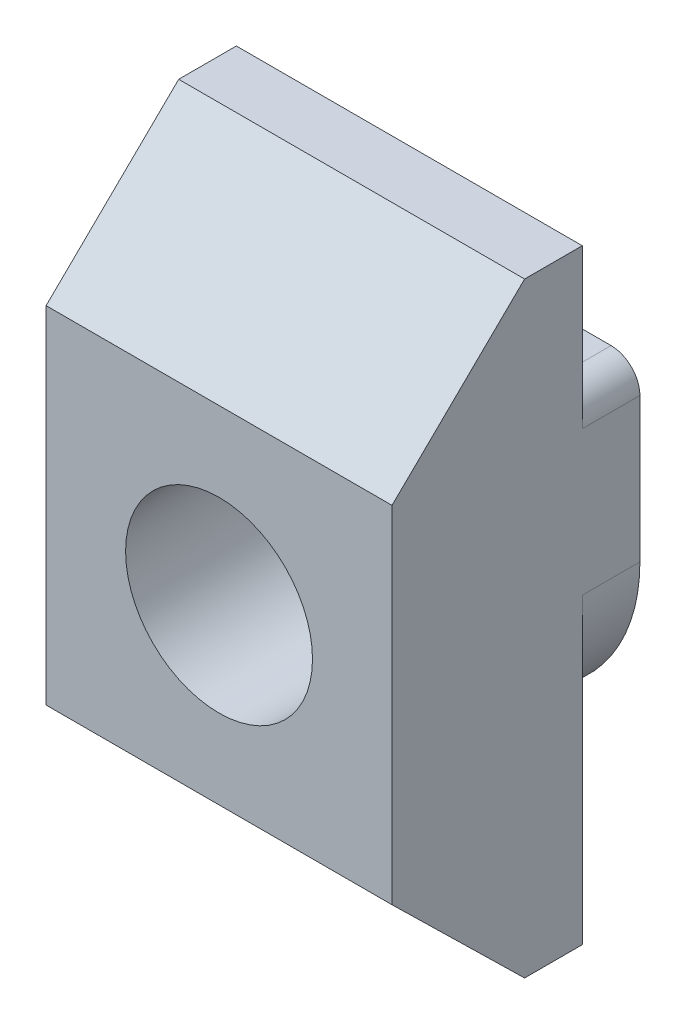
ISO-10303-21;
HEADER;
FILE_DESCRIPTION(('STEP AP214'),'2;1');
FILE_NAME('part.step','',(''),(''),'','','');
FILE_SCHEMA(('AUTOMOTIVE_DESIGN { 1 0 10303 214 1 1 1 1 }'));
ENDSEC;
DATA;
#1=APPLICATION_CONTEXT('core data for automotive mechanical design processes');
#2=APPLICATION_PROTOCOL_DEFINITION('international standard','automotive_design',2000,#1);
#3=PRODUCT_CONTEXT('',#1,'mechanical');
#4=PRODUCT('Part','Part','',(#3));
#5=PRODUCT_RELATED_PRODUCT_CATEGORY('part','',(#4));
#6=PRODUCT_DEFINITION_FORMATION('','',#4);
#7=PRODUCT_DEFINITION_CONTEXT('part definition',#1,'design');
#8=PRODUCT_DEFINITION('design','',#6,#7);
#9=PRODUCT_DEFINITION_SHAPE('','',#8);
#10=(LENGTH_UNIT() NAMED_UNIT(*) SI_UNIT(.MILLI.,.METRE.));
#11=(NAMED_UNIT(*) PLANE_ANGLE_UNIT() SI_UNIT($,.RADIAN.));
#12=(NAMED_UNIT(*) SI_UNIT($,.STERADIAN.) SOLID_ANGLE_UNIT());
#13=UNCERTAINTY_MEASURE_WITH_UNIT(LENGTH_MEASURE(1.E-05),#10,'distance_accuracy_value','');
#14=(GEOMETRIC_REPRESENTATION_CONTEXT(3) GLOBAL_UNCERTAINTY_ASSIGNED_CONTEXT((#13)) GLOBAL_UNIT_ASSIGNED_CONTEXT((#10,
#11,#12)) REPRESENTATION_CONTEXT('',''));
#15=CARTESIAN_POINT('',(0.,0.,0.));
#16=DIRECTION('',(0.,0.,1.));
#17=DIRECTION('',(1.,0.,0.));
#18=AXIS2_PLACEMENT_3D('',#15,#16,#17);
#19=CARTESIAN_POINT('',(0.,0.,-500.));
#20=DIRECTION('',(0.,0.,1.));
#21=DIRECTION('',(-1.,0.,0.));
#22=AXIS2_PLACEMENT_3D('',#19,#20,#21);
#23=CYLINDRICAL_SURFACE('',#22,1.621);
#24=CARTESIAN_POINT('',(0.,0.,-1.));
#25=DIRECTION('',(0.,0.,-1.));
#26=DIRECTION('',(-1.,0.,0.));
#27=AXIS2_PLACEMENT_3D('',#24,#25,#26);
#28=CIRCLE('',#27,1.621);
#29=CARTESIAN_POINT('',(-1.621,0.,-1.));
#30=VERTEX_POINT('',#29);
#31=EDGE_CURVE('E11',#30,#30,#28,.T.);
#32=ORIENTED_EDGE('',*,*,#31,.T.);
#33=EDGE_LOOP('',(#32));
#34=FACE_BOUND('',#33,.T.);
#35=CARTESIAN_POINT('',(0.,0.,3.3));
#36=DIRECTION('',(0.,0.,-1.));
#37=DIRECTION('',(-1.,0.,0.));
#38=AXIS2_PLACEMENT_3D('',#35,#36,#37);
#39=CIRCLE('',#38,1.621);
#40=CARTESIAN_POINT('',(-1.621,0.,3.3));
#41=VERTEX_POINT('',#40);
#42=EDGE_CURVE('E187',#41,#41,#39,.T.);
#43=ORIENTED_EDGE('',*,*,#42,.F.);
#44=EDGE_LOOP('',(#43));
#45=FACE_BOUND('',#44,.T.);
#46=ADVANCED_FACE('F19',(#34,#45),#23,.F.);
#47=CARTESIAN_POINT('',(0.,0.,-1.));
#48=DIRECTION('',(0.,0.,1.));
#49=DIRECTION('',(1.,0.,0.));
#50=AXIS2_PLACEMENT_3D('',#47,#48,#49);
#51=PLANE('',#50);
#52=ORIENTED_EDGE('',*,*,#31,.F.);
#53=EDGE_LOOP('',(#52));
#54=FACE_BOUND('',#53,.T.);
#55=CARTESIAN_POINT('',(0.,0.,-1.));
#56=DIRECTION('',(0.,0.,1.));
#57=DIRECTION('',(1.,0.,0.));
#58=AXIS2_PLACEMENT_3D('',#55,#56,#57);
#59=CIRCLE('',#58,3.);
#60=CARTESIAN_POINT('',(0.,3.,-1.));
#61=VERTEX_POINT('',#60);
#62=CARTESIAN_POINT('',(-3.,0.,-1.));
#63=VERTEX_POINT('',#62);
#64=EDGE_CURVE('E147',#61,#63,#59,.T.);
#65=ORIENTED_EDGE('',*,*,#64,.F.);
#66=DIRECTION('',(-1.,0.,0.));
#67=VECTOR('',#66,1.);
#68=CARTESIAN_POINT('',(2.5,3.,-1.));
#69=LINE('',#68,#67);
#70=CARTESIAN_POINT('',(2.5,3.,-1.));
#71=VERTEX_POINT('',#70);
#72=EDGE_CURVE('E152',#71,#61,#69,.T.);
#73=ORIENTED_EDGE('',*,*,#72,.F.);
#74=CARTESIAN_POINT('',(2.5,2.5,-1.));
#75=DIRECTION('',(0.,0.,1.));
#76=DIRECTION('',(1.,0.,0.));
#77=AXIS2_PLACEMENT_3D('',#74,#75,#76);
#78=CIRCLE('',#77,0.5);
#79=CARTESIAN_POINT('',(3.,2.5,-1.));
#80=VERTEX_POINT('',#79);
#81=EDGE_CURVE('E181',#80,#71,#78,.T.);
#82=ORIENTED_EDGE('',*,*,#81,.F.);
#83=DIRECTION('',(0.,1.,0.));
#84=VECTOR('',#83,1.);
#85=CARTESIAN_POINT('',(3.,0.,-1.));
#86=LINE('',#85,#84);
#87=CARTESIAN_POINT('',(3.,0.,-1.));
#88=VERTEX_POINT('',#87);
#89=EDGE_CURVE('E230',#88,#80,#86,.T.);
#90=ORIENTED_EDGE('',*,*,#89,.F.);
#91=CARTESIAN_POINT('',(0.,0.,-1.));
#92=DIRECTION('',(0.,0.,1.));
#93=DIRECTION('',(1.,0.,0.));
#94=AXIS2_PLACEMENT_3D('',#91,#92,#93);
#95=CIRCLE('',#94,3.);
#96=CARTESIAN_POINT('',(0.,-3.,-1.));
#97=VERTEX_POINT('',#96);
#98=EDGE_CURVE('E232',#97,#88,#95,.T.);
#99=ORIENTED_EDGE('',*,*,#98,.F.);
#100=DIRECTION('',(1.,0.,0.));
#101=VECTOR('',#100,1.);
#102=CARTESIAN_POINT('',(-2.5,-3.,-1.));
#103=LINE('',#102,#101);
#104=CARTESIAN_POINT('',(-2.5,-3.,-1.));
#105=VERTEX_POINT('',#104);
#106=EDGE_CURVE('E201',#105,#97,#103,.T.);
#107=ORIENTED_EDGE('',*,*,#106,.F.);
#108=CARTESIAN_POINT('',(-2.5,-2.5,-1.));
#109=DIRECTION('',(0.,0.,1.));
#110=DIRECTION('',(1.,0.,0.));
#111=AXIS2_PLACEMENT_3D('',#108,#109,#110);
#112=CIRCLE('',#111,0.5);
#113=CARTESIAN_POINT('',(-3.,-2.5,-1.));
#114=VERTEX_POINT('',#113);
#115=EDGE_CURVE('E159',#114,#105,#112,.T.);
#116=ORIENTED_EDGE('',*,*,#115,.F.);
#117=DIRECTION('',(0.,-1.,0.));
#118=VECTOR('',#117,1.);
#119=CARTESIAN_POINT('',(-3.,0.,-1.));
#120=LINE('',#119,#118);
#121=EDGE_CURVE('E30',#63,#114,#120,.T.);
#122=ORIENTED_EDGE('',*,*,#121,.F.);
#123=EDGE_LOOP('',(#65,#73,#82,#90,#99,#107,#116,#122));
#124=FACE_BOUND('',#123,.T.);
#125=ADVANCED_FACE('F149',(#54,#124),#51,.F.);
#126=CARTESIAN_POINT('',(-3.,0.,0.));
#127=DIRECTION('',(1.,0.,0.));
#128=DIRECTION('',(0.,1.,0.));
#129=AXIS2_PLACEMENT_3D('',#126,#127,#128);
#130=PLANE('',#129);
#131=DIRECTION('',(0.,-0.699294155463731,0.714834025585147));
#132=VECTOR('',#131,1.);
#133=CARTESIAN_POINT('',(-3.,5.25,1.));
#134=LINE('',#133,#132);
#135=CARTESIAN_POINT('',(-3.,5.25,1.));
#136=VERTEX_POINT('',#135);
#137=CARTESIAN_POINT('',(-3.,3.,3.3));
#138=VERTEX_POINT('',#137);
#139=EDGE_CURVE('E224',#136,#138,#134,.T.);
#140=ORIENTED_EDGE('',*,*,#139,.F.);
#141=DIRECTION('',(0.,0.,1.));
#142=VECTOR('',#141,1.);
#143=CARTESIAN_POINT('',(-3.,5.25,0.));
#144=LINE('',#143,#142);
#145=CARTESIAN_POINT('',(-3.,5.25,0.));
#146=VERTEX_POINT('',#145);
#147=EDGE_CURVE('E200',#146,#136,#144,.T.);
#148=ORIENTED_EDGE('',*,*,#147,.F.);
#149=DIRECTION('',(0.,1.,0.));
#150=VECTOR('',#149,1.);
#151=CARTESIAN_POINT('',(-3.,-5.25,0.));
#152=LINE('',#151,#150);
#153=CARTESIAN_POINT('',(-3.,0.,0.));
#154=VERTEX_POINT('',#153);
#155=EDGE_CURVE('E219',#154,#146,#152,.T.);
#156=ORIENTED_EDGE('',*,*,#155,.F.);
#157=DIRECTION('',(0.,0.,1.));
#158=VECTOR('',#157,1.);
#159=CARTESIAN_POINT('',(-3.,0.,-1.));
#160=LINE('',#159,#158);
#161=EDGE_CURVE('E158',#63,#154,#160,.T.);
#162=ORIENTED_EDGE('',*,*,#161,.F.);
#163=ORIENTED_EDGE('',*,*,#121,.T.);
#164=DIRECTION('',(0.,0.,1.));
#165=VECTOR('',#164,1.);
#166=CARTESIAN_POINT('',(-3.,-2.5,-1.));
#167=LINE('',#166,#165);
#168=CARTESIAN_POINT('',(-3.,-2.5,0.));
#169=VERTEX_POINT('',#168);
#170=EDGE_CURVE('E204',#114,#169,#167,.T.);
#171=ORIENTED_EDGE('',*,*,#170,.T.);
#172=DIRECTION('',(0.,1.,0.));
#173=VECTOR('',#172,1.);
#174=CARTESIAN_POINT('',(-3.,-5.25,0.));
#175=LINE('',#174,#173);
#176=CARTESIAN_POINT('',(-3.,-5.25,0.));
#177=VERTEX_POINT('',#176);
#178=EDGE_CURVE('E262',#177,#169,#175,.T.);
#179=ORIENTED_EDGE('',*,*,#178,.F.);
#180=DIRECTION('',(0.,0.,-1.));
#181=VECTOR('',#180,1.);
#182=CARTESIAN_POINT('',(-3.,-5.25,1.));
#183=LINE('',#182,#181);
#184=CARTESIAN_POINT('',(-3.,-5.25,1.));
#185=VERTEX_POINT('',#184);
#186=EDGE_CURVE('E199',#185,#177,#183,.T.);
#187=ORIENTED_EDGE('',*,*,#186,.F.);
#188=DIRECTION('',(0.,-0.699294155463731,-0.714834025585147));
#189=VECTOR('',#188,1.);
#190=CARTESIAN_POINT('',(-3.,-3.,3.3));
#191=LINE('',#190,#189);
#192=CARTESIAN_POINT('',(-3.,-3.,3.3));
#193=VERTEX_POINT('',#192);
#194=EDGE_CURVE('E185',#193,#185,#191,.T.);
#195=ORIENTED_EDGE('',*,*,#194,.F.);
#196=DIRECTION('',(0.,-1.,0.));
#197=VECTOR('',#196,1.);
#198=CARTESIAN_POINT('',(-3.,3.,3.3));
#199=LINE('',#198,#197);
#200=EDGE_CURVE('E272',#138,#193,#199,.T.);
#201=ORIENTED_EDGE('',*,*,#200,.F.);
#202=EDGE_LOOP('',(#140,#148,#156,#162,#163,#171,#179,#187,#195,#201));
#203=FACE_BOUND('',#202,.T.);
#204=ADVANCED_FACE('F288',(#203),#130,.F.);
#205=CARTESIAN_POINT('',(3.,0.,0.));
#206=DIRECTION('',(1.,0.,0.));
#207=DIRECTION('',(0.,1.,0.));
#208=AXIS2_PLACEMENT_3D('',#205,#206,#207);
#209=PLANE('',#208);
#210=DIRECTION('',(0.,-0.699294155463731,0.714834025585147));
#211=VECTOR('',#210,1.);
#212=CARTESIAN_POINT('',(3.,5.25,1.));
#213=LINE('',#212,#211);
#214=CARTESIAN_POINT('',(3.,5.25,1.));
#215=VERTEX_POINT('',#214);
#216=CARTESIAN_POINT('',(3.,3.,3.3));
#217=VERTEX_POINT('',#216);
#218=EDGE_CURVE('E260',#215,#217,#213,.T.);
#219=ORIENTED_EDGE('',*,*,#218,.T.);
#220=DIRECTION('',(0.,-1.,0.));
#221=VECTOR('',#220,1.);
#222=CARTESIAN_POINT('',(3.,3.,3.3));
#223=LINE('',#222,#221);
#224=CARTESIAN_POINT('',(3.,-3.,3.3));
#225=VERTEX_POINT('',#224);
#226=EDGE_CURVE('E271',#217,#225,#223,.T.);
#227=ORIENTED_EDGE('',*,*,#226,.T.);
#228=DIRECTION('',(0.,-0.699294155463731,-0.714834025585147));
#229=VECTOR('',#228,1.);
#230=CARTESIAN_POINT('',(3.,-3.,3.3));
#231=LINE('',#230,#229);
#232=CARTESIAN_POINT('',(3.,-5.25,1.));
#233=VERTEX_POINT('',#232);
#234=EDGE_CURVE('E220',#225,#233,#231,.T.);
#235=ORIENTED_EDGE('',*,*,#234,.T.);
#236=DIRECTION('',(0.,0.,-1.));
#237=VECTOR('',#236,1.);
#238=CARTESIAN_POINT('',(3.,-5.25,1.));
#239=LINE('',#238,#237);
#240=CARTESIAN_POINT('',(3.,-5.25,0.));
#241=VERTEX_POINT('',#240);
#242=EDGE_CURVE('E228',#233,#241,#239,.T.);
#243=ORIENTED_EDGE('',*,*,#242,.T.);
#244=DIRECTION('',(0.,1.,0.));
#245=VECTOR('',#244,1.);
#246=CARTESIAN_POINT('',(3.,-5.25,0.));
#247=LINE('',#246,#245);
#248=CARTESIAN_POINT('',(3.,0.,0.));
#249=VERTEX_POINT('',#248);
#250=EDGE_CURVE('E190',#241,#249,#247,.T.);
#251=ORIENTED_EDGE('',*,*,#250,.T.);
#252=DIRECTION('',(0.,0.,1.));
#253=VECTOR('',#252,1.);
#254=CARTESIAN_POINT('',(3.,0.,-1.));
#255=LINE('',#254,#253);
#256=EDGE_CURVE('E23',#88,#249,#255,.T.);
#257=ORIENTED_EDGE('',*,*,#256,.F.);
#258=ORIENTED_EDGE('',*,*,#89,.T.);
#259=DIRECTION('',(0.,0.,1.));
#260=VECTOR('',#259,1.);
#261=CARTESIAN_POINT('',(3.,2.5,-1.));
#262=LINE('',#261,#260);
#263=CARTESIAN_POINT('',(3.,2.5,0.));
#264=VERTEX_POINT('',#263);
#265=EDGE_CURVE('E359',#80,#264,#262,.T.);
#266=ORIENTED_EDGE('',*,*,#265,.T.);
#267=DIRECTION('',(0.,1.,0.));
#268=VECTOR('',#267,1.);
#269=CARTESIAN_POINT('',(3.,-5.25,0.));
#270=LINE('',#269,#268);
#271=CARTESIAN_POINT('',(3.,5.25,0.));
#272=VERTEX_POINT('',#271);
#273=EDGE_CURVE('E209',#264,#272,#270,.T.);
#274=ORIENTED_EDGE('',*,*,#273,.T.);
#275=DIRECTION('',(0.,0.,1.));
#276=VECTOR('',#275,1.);
#277=CARTESIAN_POINT('',(3.,5.25,0.));
#278=LINE('',#277,#276);
#279=EDGE_CURVE('E196',#272,#215,#278,.T.);
#280=ORIENTED_EDGE('',*,*,#279,.T.);
#281=EDGE_LOOP('',(#219,#227,#235,#243,#251,#257,#258,#266,#274,#280));
#282=FACE_BOUND('',#281,.T.);
#283=ADVANCED_FACE('F21',(#282),#209,.T.);
#284=CARTESIAN_POINT('',(0.,0.,-1.));
#285=DIRECTION('',(0.,0.,-1.));
#286=DIRECTION('',(1.,0.,0.));
#287=AXIS2_PLACEMENT_3D('',#284,#285,#286);
#288=CYLINDRICAL_SURFACE('',#287,3.);
#289=CARTESIAN_POINT('',(0.,0.,0.));
#290=DIRECTION('',(0.,0.,1.));
#291=DIRECTION('',(1.,0.,0.));
#292=AXIS2_PLACEMENT_3D('',#289,#290,#291);
#293=CIRCLE('',#292,3.);
#294=CARTESIAN_POINT('',(0.,3.,0.));
#295=VERTEX_POINT('',#294);
#296=EDGE_CURVE('E165',#295,#154,#293,.T.);
#297=ORIENTED_EDGE('',*,*,#296,.F.);
#298=DIRECTION('',(0.,0.,1.));
#299=VECTOR('',#298,1.);
#300=CARTESIAN_POINT('',(0.,3.,-1.));
#301=LINE('',#300,#299);
#302=EDGE_CURVE('E162',#61,#295,#301,.T.);
#303=ORIENTED_EDGE('',*,*,#302,.F.);
#304=ORIENTED_EDGE('',*,*,#64,.T.);
#305=ORIENTED_EDGE('',*,*,#161,.T.);
#306=EDGE_LOOP('',(#297,#303,#304,#305));
#307=FACE_BOUND('',#306,.T.);
#308=ADVANCED_FACE('F163',(#307),#288,.T.);
#309=CARTESIAN_POINT('',(-2.5,-2.5,-1.));
#310=DIRECTION('',(0.,0.,-1.));
#311=DIRECTION('',(1.,0.,0.));
#312=AXIS2_PLACEMENT_3D('',#309,#310,#311);
#313=CYLINDRICAL_SURFACE('',#312,0.5);
#314=CARTESIAN_POINT('',(-2.5,-2.5,0.));
#315=DIRECTION('',(0.,0.,1.));
#316=DIRECTION('',(1.,0.,0.));
#317=AXIS2_PLACEMENT_3D('',#314,#315,#316);
#318=CIRCLE('',#317,0.5);
#319=CARTESIAN_POINT('',(-2.5,-3.,0.));
#320=VERTEX_POINT('',#319);
#321=EDGE_CURVE('E250',#169,#320,#318,.T.);
#322=ORIENTED_EDGE('',*,*,#321,.F.);
#323=ORIENTED_EDGE('',*,*,#170,.F.);
#324=ORIENTED_EDGE('',*,*,#115,.T.);
#325=DIRECTION('',(0.,0.,1.));
#326=VECTOR('',#325,1.);
#327=CARTESIAN_POINT('',(-2.5,-3.,-1.));
#328=LINE('',#327,#326);
#329=EDGE_CURVE('E205',#105,#320,#328,.T.);
#330=ORIENTED_EDGE('',*,*,#329,.T.);
#331=EDGE_LOOP('',(#322,#323,#324,#330));
#332=FACE_BOUND('',#331,.T.);
#333=ADVANCED_FACE('F293',(#332),#313,.T.);
#334=CARTESIAN_POINT('',(-2.5,-3.,-1.));
#335=DIRECTION('',(0.,-1.,0.));
#336=DIRECTION('',(0.,0.,-1.));
#337=AXIS2_PLACEMENT_3D('',#334,#335,#336);
#338=PLANE('',#337);
#339=DIRECTION('',(1.,0.,0.));
#340=VECTOR('',#339,1.);
#341=CARTESIAN_POINT('',(-2.5,-3.,0.));
#342=LINE('',#341,#340);
#343=CARTESIAN_POINT('',(0.,-3.,0.));
#344=VERTEX_POINT('',#343);
#345=EDGE_CURVE('E275',#320,#344,#342,.T.);
#346=ORIENTED_EDGE('',*,*,#345,.F.);
#347=ORIENTED_EDGE('',*,*,#329,.F.);
#348=ORIENTED_EDGE('',*,*,#106,.T.);
#349=DIRECTION('',(0.,0.,1.));
#350=VECTOR('',#349,1.);
#351=CARTESIAN_POINT('',(0.,-3.,-1.));
#352=LINE('',#351,#350);
#353=EDGE_CURVE('E170',#97,#344,#352,.T.);
#354=ORIENTED_EDGE('',*,*,#353,.T.);
#355=EDGE_LOOP('',(#346,#347,#348,#354));
#356=FACE_BOUND('',#355,.T.);
#357=ADVANCED_FACE('F409',(#356),#338,.T.);
#358=CARTESIAN_POINT('',(0.,0.,-1.));
#359=DIRECTION('',(0.,0.,-1.));
#360=DIRECTION('',(1.,0.,0.));
#361=AXIS2_PLACEMENT_3D('',#358,#359,#360);
#362=CYLINDRICAL_SURFACE('',#361,3.);
#363=CARTESIAN_POINT('',(0.,0.,0.));
#364=DIRECTION('',(0.,0.,1.));
#365=DIRECTION('',(1.,0.,0.));
#366=AXIS2_PLACEMENT_3D('',#363,#364,#365);
#367=CIRCLE('',#366,3.);
#368=EDGE_CURVE('E195',#344,#249,#367,.T.);
#369=ORIENTED_EDGE('',*,*,#368,.F.);
#370=ORIENTED_EDGE('',*,*,#353,.F.);
#371=ORIENTED_EDGE('',*,*,#98,.T.);
#372=ORIENTED_EDGE('',*,*,#256,.T.);
#373=EDGE_LOOP('',(#369,#370,#371,#372));
#374=FACE_BOUND('',#373,.T.);
#375=ADVANCED_FACE('F419',(#374),#362,.T.);
#376=CARTESIAN_POINT('',(2.5,3.,-1.));
#377=DIRECTION('',(0.,1.,0.));
#378=DIRECTION('',(1.,0.,0.));
#379=AXIS2_PLACEMENT_3D('',#376,#377,#378);
#380=PLANE('',#379);
#381=DIRECTION('',(-1.,0.,0.));
#382=VECTOR('',#381,1.);
#383=CARTESIAN_POINT('',(2.5,3.,0.));
#384=LINE('',#383,#382);
#385=CARTESIAN_POINT('',(2.5,3.,0.));
#386=VERTEX_POINT('',#385);
#387=EDGE_CURVE('E255',#386,#295,#384,.T.);
#388=ORIENTED_EDGE('',*,*,#387,.F.);
#389=DIRECTION('',(0.,0.,1.));
#390=VECTOR('',#389,1.);
#391=CARTESIAN_POINT('',(2.5,3.,-1.));
#392=LINE('',#391,#390);
#393=EDGE_CURVE('E173',#71,#386,#392,.T.);
#394=ORIENTED_EDGE('',*,*,#393,.F.);
#395=ORIENTED_EDGE('',*,*,#72,.T.);
#396=ORIENTED_EDGE('',*,*,#302,.T.);
#397=EDGE_LOOP('',(#388,#394,#395,#396));
#398=FACE_BOUND('',#397,.T.);
#399=ADVANCED_FACE('F172',(#398),#380,.T.);
#400=CARTESIAN_POINT('',(2.5,2.5,-1.));
#401=DIRECTION('',(0.,0.,-1.));
#402=DIRECTION('',(1.,0.,0.));
#403=AXIS2_PLACEMENT_3D('',#400,#401,#402);
#404=CYLINDRICAL_SURFACE('',#403,0.5);
#405=CARTESIAN_POINT('',(2.5,2.5,0.));
#406=DIRECTION('',(0.,0.,1.));
#407=DIRECTION('',(1.,0.,0.));
#408=AXIS2_PLACEMENT_3D('',#405,#406,#407);
#409=CIRCLE('',#408,0.5);
#410=EDGE_CURVE('E208',#264,#386,#409,.T.);
#411=ORIENTED_EDGE('',*,*,#410,.F.);
#412=ORIENTED_EDGE('',*,*,#265,.F.);
#413=ORIENTED_EDGE('',*,*,#81,.T.);
#414=ORIENTED_EDGE('',*,*,#393,.T.);
#415=EDGE_LOOP('',(#411,#412,#413,#414));
#416=FACE_BOUND('',#415,.T.);
#417=ADVANCED_FACE('F362',(#416),#404,.T.);
#418=CARTESIAN_POINT('',(3.,-5.25,1.));
#419=DIRECTION('',(0.,1.,0.));
#420=DIRECTION('',(1.,0.,0.));
#421=AXIS2_PLACEMENT_3D('',#418,#419,#420);
#422=PLANE('',#421);
#423=ORIENTED_EDGE('',*,*,#186,.T.);
#424=DIRECTION('',(-1.,0.,0.));
#425=VECTOR('',#424,1.);
#426=CARTESIAN_POINT('',(3.,-5.25,0.));
#427=LINE('',#426,#425);
#428=EDGE_CURVE('E194',#241,#177,#427,.T.);
#429=ORIENTED_EDGE('',*,*,#428,.F.);
#430=ORIENTED_EDGE('',*,*,#242,.F.);
#431=DIRECTION('',(-1.,0.,0.));
#432=VECTOR('',#431,1.);
#433=CARTESIAN_POINT('',(3.,-5.25,1.));
#434=LINE('',#433,#432);
#435=EDGE_CURVE('E225',#233,#185,#434,.T.);
#436=ORIENTED_EDGE('',*,*,#435,.T.);
#437=EDGE_LOOP('',(#423,#429,#430,#436));
#438=FACE_BOUND('',#437,.T.);
#439=ADVANCED_FACE('F377',(#438),#422,.F.);
#440=CARTESIAN_POINT('',(3.,5.25,0.));
#441=DIRECTION('',(0.,-1.,0.));
#442=DIRECTION('',(0.,0.,-1.));
#443=AXIS2_PLACEMENT_3D('',#440,#441,#442);
#444=PLANE('',#443);
#445=ORIENTED_EDGE('',*,*,#147,.T.);
#446=DIRECTION('',(-1.,0.,0.));
#447=VECTOR('',#446,1.);
#448=CARTESIAN_POINT('',(3.,5.25,1.));
#449=LINE('',#448,#447);
#450=EDGE_CURVE('E266',#215,#136,#449,.T.);
#451=ORIENTED_EDGE('',*,*,#450,.F.);
#452=ORIENTED_EDGE('',*,*,#279,.F.);
#453=DIRECTION('',(-1.,0.,0.));
#454=VECTOR('',#453,1.);
#455=CARTESIAN_POINT('',(3.,5.25,0.));
#456=LINE('',#455,#454);
#457=EDGE_CURVE('E213',#272,#146,#456,.T.);
#458=ORIENTED_EDGE('',*,*,#457,.T.);
#459=EDGE_LOOP('',(#445,#451,#452,#458));
#460=FACE_BOUND('',#459,.T.);
#461=ADVANCED_FACE('F345',(#460),#444,.F.);
#462=CARTESIAN_POINT('',(3.,-5.25,0.));
#463=DIRECTION('',(0.,0.,1.));
#464=DIRECTION('',(1.,0.,0.));
#465=AXIS2_PLACEMENT_3D('',#462,#463,#464);
#466=PLANE('',#465);
#467=ORIENTED_EDGE('',*,*,#387,.T.);
#468=ORIENTED_EDGE('',*,*,#296,.T.);
#469=ORIENTED_EDGE('',*,*,#155,.T.);
#470=ORIENTED_EDGE('',*,*,#457,.F.);
#471=ORIENTED_EDGE('',*,*,#273,.F.);
#472=ORIENTED_EDGE('',*,*,#410,.T.);
#473=EDGE_LOOP('',(#467,#468,#469,#470,#471,#472));
#474=FACE_BOUND('',#473,.T.);
#475=ADVANCED_FACE('F347',(#474),#466,.F.);
#476=CARTESIAN_POINT('',(3.,-5.25,0.));
#477=DIRECTION('',(0.,0.,1.));
#478=DIRECTION('',(1.,0.,0.));
#479=AXIS2_PLACEMENT_3D('',#476,#477,#478);
#480=PLANE('',#479);
#481=ORIENTED_EDGE('',*,*,#178,.T.);
#482=ORIENTED_EDGE('',*,*,#321,.T.);
#483=ORIENTED_EDGE('',*,*,#345,.T.);
#484=ORIENTED_EDGE('',*,*,#368,.T.);
#485=ORIENTED_EDGE('',*,*,#250,.F.);
#486=ORIENTED_EDGE('',*,*,#428,.T.);
#487=EDGE_LOOP('',(#481,#482,#483,#484,#485,#486));
#488=FACE_BOUND('',#487,.T.);
#489=ADVANCED_FACE('F283',(#488),#480,.F.);
#490=CARTESIAN_POINT('',(3.,5.25,1.));
#491=DIRECTION('',(0.,-0.714834025585147,-0.699294155463731));
#492=DIRECTION('',(0.,0.699294155463731,-0.714834025585147));
#493=AXIS2_PLACEMENT_3D('',#490,#491,#492);
#494=PLANE('',#493);
#495=ORIENTED_EDGE('',*,*,#139,.T.);
#496=DIRECTION('',(-1.,0.,0.));
#497=VECTOR('',#496,1.);
#498=CARTESIAN_POINT('',(3.,3.,3.3));
#499=LINE('',#498,#497);
#500=EDGE_CURVE('E189',#217,#138,#499,.T.);
#501=ORIENTED_EDGE('',*,*,#500,.F.);
#502=ORIENTED_EDGE('',*,*,#218,.F.);
#503=ORIENTED_EDGE('',*,*,#450,.T.);
#504=EDGE_LOOP('',(#495,#501,#502,#503));
#505=FACE_BOUND('',#504,.T.);
#506=ADVANCED_FACE('F327',(#505),#494,.F.);
#507=CARTESIAN_POINT('',(3.,-3.,3.3));
#508=DIRECTION('',(0.,0.714834025585147,-0.699294155463731));
#509=DIRECTION('',(-1.,0.,0.));
#510=AXIS2_PLACEMENT_3D('',#507,#508,#509);
#511=PLANE('',#510);
#512=ORIENTED_EDGE('',*,*,#194,.T.);
#513=ORIENTED_EDGE('',*,*,#435,.F.);
#514=ORIENTED_EDGE('',*,*,#234,.F.);
#515=DIRECTION('',(-1.,0.,0.));
#516=VECTOR('',#515,1.);
#517=CARTESIAN_POINT('',(3.,-3.,3.3));
#518=LINE('',#517,#516);
#519=EDGE_CURVE('E267',#225,#193,#518,.T.);
#520=ORIENTED_EDGE('',*,*,#519,.T.);
#521=EDGE_LOOP('',(#512,#513,#514,#520));
#522=FACE_BOUND('',#521,.T.);
#523=ADVANCED_FACE('F379',(#522),#511,.F.);
#524=CARTESIAN_POINT('',(3.,3.,3.3));
#525=DIRECTION('',(0.,0.,-1.));
#526=DIRECTION('',(0.,-1.,0.));
#527=AXIS2_PLACEMENT_3D('',#524,#525,#526);
#528=PLANE('',#527);
#529=ORIENTED_EDGE('',*,*,#42,.T.);
#530=EDGE_LOOP('',(#529));
#531=FACE_BOUND('',#530,.T.);
#532=ORIENTED_EDGE('',*,*,#200,.T.);
#533=ORIENTED_EDGE('',*,*,#519,.F.);
#534=ORIENTED_EDGE('',*,*,#226,.F.);
#535=ORIENTED_EDGE('',*,*,#500,.T.);
#536=EDGE_LOOP('',(#532,#533,#534,#535));
#537=FACE_BOUND('',#536,.T.);
#538=ADVANCED_FACE('F337',(#531,#537),#528,.F.);
#539=CLOSED_SHELL('',(#46,#125,#204,#283,#308,#333,#357,#375,#399,#417,#439,#461,#475,#489,#506,
#523,#538));
#540=MANIFOLD_SOLID_BREP('B1',#539);
#541=ADVANCED_BREP_SHAPE_REPRESENTATION('',(#18,#540),#14);
#542=SHAPE_DEFINITION_REPRESENTATION(#9,#541);
ENDSEC;
END-ISO-10303-21;
